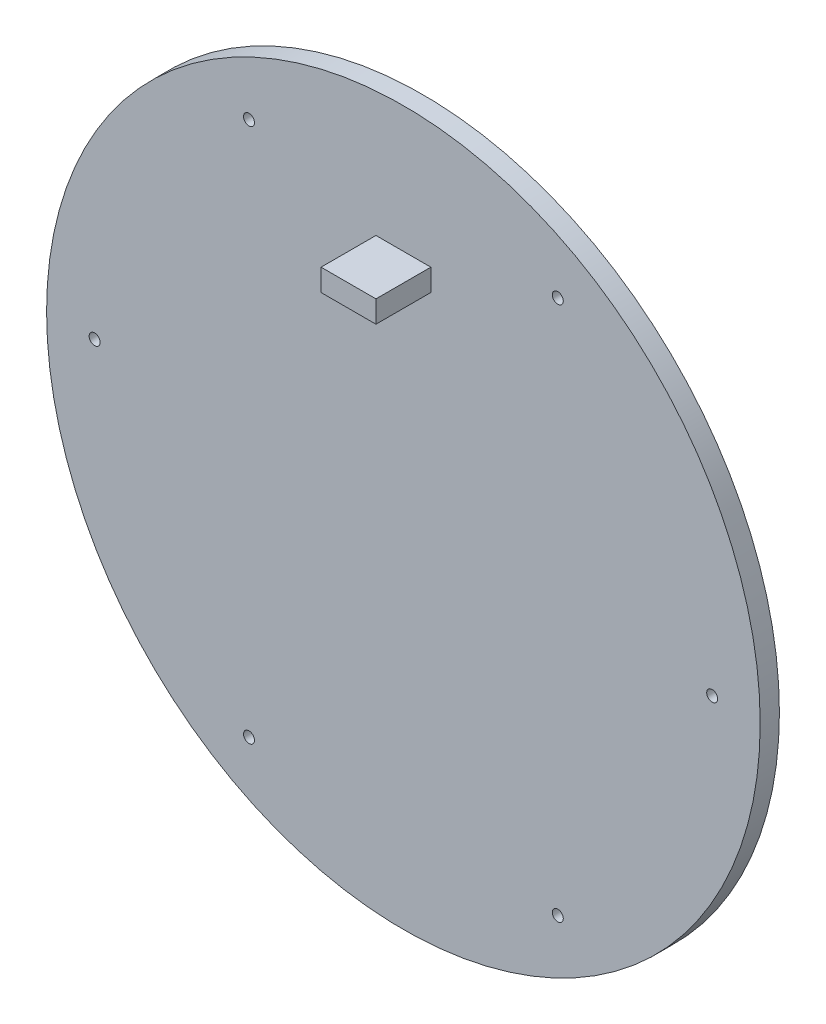
ISO-10303-21;
HEADER;
FILE_DESCRIPTION(('STEP AP214'),'2;1');
FILE_NAME('part.step','',(''),(''),'','','');
FILE_SCHEMA(('AUTOMOTIVE_DESIGN { 1 0 10303 214 1 1 1 1 }'));
ENDSEC;
DATA;
#1=APPLICATION_CONTEXT('core data for automotive mechanical design processes');
#2=APPLICATION_PROTOCOL_DEFINITION('international standard','automotive_design',2000,#1);
#3=PRODUCT_CONTEXT('',#1,'mechanical');
#4=PRODUCT('Part','Part','',(#3));
#5=PRODUCT_RELATED_PRODUCT_CATEGORY('part','',(#4));
#6=PRODUCT_DEFINITION_FORMATION('','',#4);
#7=PRODUCT_DEFINITION_CONTEXT('part definition',#1,'design');
#8=PRODUCT_DEFINITION('design','',#6,#7);
#9=PRODUCT_DEFINITION_SHAPE('','',#8);
#10=(LENGTH_UNIT() NAMED_UNIT(*) SI_UNIT(.MILLI.,.METRE.));
#11=(NAMED_UNIT(*) PLANE_ANGLE_UNIT() SI_UNIT($,.RADIAN.));
#12=(NAMED_UNIT(*) SI_UNIT($,.STERADIAN.) SOLID_ANGLE_UNIT());
#13=UNCERTAINTY_MEASURE_WITH_UNIT(LENGTH_MEASURE(1.E-05),#10,'distance_accuracy_value','');
#14=(GEOMETRIC_REPRESENTATION_CONTEXT(3) GLOBAL_UNCERTAINTY_ASSIGNED_CONTEXT((#13)) GLOBAL_UNIT_ASSIGNED_CONTEXT((#10,
#11,#12)) REPRESENTATION_CONTEXT('',''));
#15=CARTESIAN_POINT('',(0.,0.,0.));
#16=DIRECTION('',(0.,0.,1.));
#17=DIRECTION('',(1.,0.,0.));
#18=AXIS2_PLACEMENT_3D('',#15,#16,#17);
#19=CARTESIAN_POINT('',(0.,0.,3.5));
#20=DIRECTION('',(0.,0.,1.));
#21=DIRECTION('',(1.,0.,0.));
#22=AXIS2_PLACEMENT_3D('',#19,#20,#21);
#23=PLANE('',#22);
#24=CARTESIAN_POINT('',(-56.25,0.,3.5));
#25=DIRECTION('',(0.,0.,1.));
#26=DIRECTION('',(1.,0.,0.));
#27=AXIS2_PLACEMENT_3D('',#24,#25,#26);
#28=CIRCLE('',#27,0.999999999999998);
#29=CARTESIAN_POINT('',(-55.25,0.,3.5));
#30=VERTEX_POINT('',#29);
#31=EDGE_CURVE('E171',#30,#30,#28,.T.);
#32=ORIENTED_EDGE('',*,*,#31,.F.);
#33=EDGE_LOOP('',(#32));
#34=FACE_BOUND('',#33,.T.);
#35=CARTESIAN_POINT('',(-28.1250000000006,48.7139289628743,3.5));
#36=DIRECTION('',(0.,0.,1.));
#37=DIRECTION('',(1.,0.,0.));
#38=AXIS2_PLACEMENT_3D('',#35,#36,#37);
#39=CIRCLE('',#38,0.999999999999995);
#40=CARTESIAN_POINT('',(-27.1250000000006,48.7139289628743,3.5));
#41=VERTEX_POINT('',#40);
#42=EDGE_CURVE('E176',#41,#41,#39,.T.);
#43=ORIENTED_EDGE('',*,*,#42,.F.);
#44=EDGE_LOOP('',(#43));
#45=FACE_BOUND('',#44,.T.);
#46=CARTESIAN_POINT('',(28.1249999999995,48.7139289628749,3.5));
#47=DIRECTION('',(0.,0.,1.));
#48=DIRECTION('',(1.,0.,0.));
#49=AXIS2_PLACEMENT_3D('',#46,#47,#48);
#50=CIRCLE('',#49,0.999999999999996);
#51=CARTESIAN_POINT('',(29.1249999999995,48.7139289628749,3.5));
#52=VERTEX_POINT('',#51);
#53=EDGE_CURVE('E230',#52,#52,#50,.T.);
#54=ORIENTED_EDGE('',*,*,#53,.F.);
#55=EDGE_LOOP('',(#54));
#56=FACE_BOUND('',#55,.T.);
#57=CARTESIAN_POINT('',(56.25,3.92791650619852E-13,3.5));
#58=DIRECTION('',(0.,0.,1.));
#59=DIRECTION('',(1.,0.,0.));
#60=AXIS2_PLACEMENT_3D('',#57,#58,#59);
#61=CIRCLE('',#60,0.999999999999996);
#62=CARTESIAN_POINT('',(57.25,3.92791650619852E-13,3.5));
#63=VERTEX_POINT('',#62);
#64=EDGE_CURVE('E233',#63,#63,#61,.T.);
#65=ORIENTED_EDGE('',*,*,#64,.F.);
#66=EDGE_LOOP('',(#65));
#67=FACE_BOUND('',#66,.T.);
#68=CARTESIAN_POINT('',(28.1250000000002,-48.7139289628746,3.5));
#69=DIRECTION('',(0.,0.,1.));
#70=DIRECTION('',(1.,0.,0.));
#71=AXIS2_PLACEMENT_3D('',#68,#69,#70);
#72=CIRCLE('',#71,0.999999999999994);
#73=CARTESIAN_POINT('',(29.1250000000002,-48.7139289628746,3.5));
#74=VERTEX_POINT('',#73);
#75=EDGE_CURVE('E236',#74,#74,#72,.T.);
#76=ORIENTED_EDGE('',*,*,#75,.F.);
#77=EDGE_LOOP('',(#76));
#78=FACE_BOUND('',#77,.T.);
#79=CARTESIAN_POINT('',(-28.1249999999999,-48.7139289628747,3.5));
#80=DIRECTION('',(0.,0.,1.));
#81=DIRECTION('',(1.,0.,0.));
#82=AXIS2_PLACEMENT_3D('',#79,#80,#81);
#83=CIRCLE('',#82,0.999999999999996);
#84=CARTESIAN_POINT('',(-27.1249999999999,-48.7139289628747,3.5));
#85=VERTEX_POINT('',#84);
#86=EDGE_CURVE('E239',#85,#85,#83,.T.);
#87=ORIENTED_EDGE('',*,*,#86,.F.);
#88=EDGE_LOOP('',(#87));
#89=FACE_BOUND('',#88,.T.);
#90=CARTESIAN_POINT('',(0.,0.,3.5));
#91=DIRECTION('',(0.,0.,1.));
#92=DIRECTION('',(1.,0.,0.));
#93=AXIS2_PLACEMENT_3D('',#90,#91,#92);
#94=CIRCLE('',#93,65.);
#95=CARTESIAN_POINT('',(65.,0.,3.5));
#96=VERTEX_POINT('',#95);
#97=EDGE_CURVE('E143',#96,#96,#94,.T.);
#98=ORIENTED_EDGE('',*,*,#97,.T.);
#99=EDGE_LOOP('',(#98));
#100=FACE_BOUND('',#99,.T.);
#101=DIRECTION('',(1.,0.,0.));
#102=VECTOR('',#101,1.);
#103=CARTESIAN_POINT('',(0.,42.,3.5));
#104=LINE('',#103,#102);
#105=CARTESIAN_POINT('',(-5.,42.,3.5));
#106=VERTEX_POINT('',#105);
#107=CARTESIAN_POINT('',(5.,42.,3.5));
#108=VERTEX_POINT('',#107);
#109=EDGE_CURVE('E139',#106,#108,#104,.T.);
#110=ORIENTED_EDGE('',*,*,#109,.T.);
#111=DIRECTION('',(0.,-1.,0.));
#112=VECTOR('',#111,1.);
#113=CARTESIAN_POINT('',(5.,0.,3.5));
#114=LINE('',#113,#112);
#115=CARTESIAN_POINT('',(5.,38.,3.5));
#116=VERTEX_POINT('',#115);
#117=EDGE_CURVE('E127',#108,#116,#114,.T.);
#118=ORIENTED_EDGE('',*,*,#117,.T.);
#119=DIRECTION('',(-1.,0.,0.));
#120=VECTOR('',#119,1.);
#121=CARTESIAN_POINT('',(0.,38.,3.5));
#122=LINE('',#121,#120);
#123=CARTESIAN_POINT('',(-5.,38.,3.5));
#124=VERTEX_POINT('',#123);
#125=EDGE_CURVE('E128',#116,#124,#122,.T.);
#126=ORIENTED_EDGE('',*,*,#125,.T.);
#127=DIRECTION('',(0.,1.,0.));
#128=VECTOR('',#127,1.);
#129=CARTESIAN_POINT('',(-5.,0.,3.5));
#130=LINE('',#129,#128);
#131=EDGE_CURVE('E132',#124,#106,#130,.T.);
#132=ORIENTED_EDGE('',*,*,#131,.T.);
#133=EDGE_LOOP('',(#110,#118,#126,#132));
#134=FACE_BOUND('',#133,.T.);
#135=ADVANCED_FACE('F40',(#34,#45,#56,#67,#78,#89,#100,#134),#23,.T.);
#136=CARTESIAN_POINT('',(0.,0.,0.));
#137=DIRECTION('',(0.,0.,1.));
#138=DIRECTION('',(1.,0.,0.));
#139=AXIS2_PLACEMENT_3D('',#136,#137,#138);
#140=PLANE('',#139);
#141=CARTESIAN_POINT('',(-56.25,0.,0.));
#142=DIRECTION('',(0.,0.,-1.));
#143=DIRECTION('',(-1.,0.,0.));
#144=AXIS2_PLACEMENT_3D('',#141,#142,#143);
#145=CIRCLE('',#144,0.999999999999998);
#146=CARTESIAN_POINT('',(-57.25,0.,0.));
#147=VERTEX_POINT('',#146);
#148=EDGE_CURVE('E242',#147,#147,#145,.T.);
#149=ORIENTED_EDGE('',*,*,#148,.F.);
#150=EDGE_LOOP('',(#149));
#151=FACE_BOUND('',#150,.T.);
#152=CARTESIAN_POINT('',(-28.1250000000006,48.7139289628743,0.));
#153=DIRECTION('',(0.,0.,-1.));
#154=DIRECTION('',(-1.,0.,0.));
#155=AXIS2_PLACEMENT_3D('',#152,#153,#154);
#156=CIRCLE('',#155,0.999999999999995);
#157=CARTESIAN_POINT('',(-29.1250000000006,48.7139289628743,0.));
#158=VERTEX_POINT('',#157);
#159=EDGE_CURVE('E247',#158,#158,#156,.T.);
#160=ORIENTED_EDGE('',*,*,#159,.F.);
#161=EDGE_LOOP('',(#160));
#162=FACE_BOUND('',#161,.T.);
#163=CARTESIAN_POINT('',(28.1249999999995,48.7139289628749,0.));
#164=DIRECTION('',(0.,0.,-1.));
#165=DIRECTION('',(-1.,0.,0.));
#166=AXIS2_PLACEMENT_3D('',#163,#164,#165);
#167=CIRCLE('',#166,0.999999999999996);
#168=CARTESIAN_POINT('',(27.1249999999996,48.7139289628749,0.));
#169=VERTEX_POINT('',#168);
#170=EDGE_CURVE('E243',#169,#169,#167,.T.);
#171=ORIENTED_EDGE('',*,*,#170,.F.);
#172=EDGE_LOOP('',(#171));
#173=FACE_BOUND('',#172,.T.);
#174=CARTESIAN_POINT('',(56.25,3.92791650619852E-13,0.));
#175=DIRECTION('',(0.,0.,-1.));
#176=DIRECTION('',(-1.,0.,0.));
#177=AXIS2_PLACEMENT_3D('',#174,#175,#176);
#178=CIRCLE('',#177,0.999999999999996);
#179=CARTESIAN_POINT('',(55.25,3.92791650619852E-13,0.));
#180=VERTEX_POINT('',#179);
#181=EDGE_CURVE('E246',#180,#180,#178,.T.);
#182=ORIENTED_EDGE('',*,*,#181,.F.);
#183=EDGE_LOOP('',(#182));
#184=FACE_BOUND('',#183,.T.);
#185=CARTESIAN_POINT('',(28.1250000000002,-48.7139289628746,0.));
#186=DIRECTION('',(0.,0.,-1.));
#187=DIRECTION('',(-1.,0.,0.));
#188=AXIS2_PLACEMENT_3D('',#185,#186,#187);
#189=CIRCLE('',#188,0.999999999999994);
#190=CARTESIAN_POINT('',(27.1250000000002,-48.7139289628746,0.));
#191=VERTEX_POINT('',#190);
#192=EDGE_CURVE('E250',#191,#191,#189,.T.);
#193=ORIENTED_EDGE('',*,*,#192,.F.);
#194=EDGE_LOOP('',(#193));
#195=FACE_BOUND('',#194,.T.);
#196=CARTESIAN_POINT('',(-28.1249999999999,-48.7139289628747,0.));
#197=DIRECTION('',(0.,0.,-1.));
#198=DIRECTION('',(-1.,0.,0.));
#199=AXIS2_PLACEMENT_3D('',#196,#197,#198);
#200=CIRCLE('',#199,0.999999999999996);
#201=CARTESIAN_POINT('',(-29.1249999999999,-48.7139289628747,0.));
#202=VERTEX_POINT('',#201);
#203=EDGE_CURVE('E253',#202,#202,#200,.T.);
#204=ORIENTED_EDGE('',*,*,#203,.F.);
#205=EDGE_LOOP('',(#204));
#206=FACE_BOUND('',#205,.T.);
#207=CARTESIAN_POINT('',(0.,0.,0.));
#208=DIRECTION('',(0.,0.,1.));
#209=DIRECTION('',(1.,0.,0.));
#210=AXIS2_PLACEMENT_3D('',#207,#208,#209);
#211=CIRCLE('',#210,65.);
#212=CARTESIAN_POINT('',(65.,0.,0.));
#213=VERTEX_POINT('',#212);
#214=EDGE_CURVE('E142',#213,#213,#211,.T.);
#215=ORIENTED_EDGE('',*,*,#214,.F.);
#216=EDGE_LOOP('',(#215));
#217=FACE_BOUND('',#216,.T.);
#218=DIRECTION('',(0.,-1.,0.));
#219=VECTOR('',#218,1.);
#220=CARTESIAN_POINT('',(5.,0.,0.));
#221=LINE('',#220,#219);
#222=CARTESIAN_POINT('',(5.,42.,0.));
#223=VERTEX_POINT('',#222);
#224=CARTESIAN_POINT('',(5.,38.,0.));
#225=VERTEX_POINT('',#224);
#226=EDGE_CURVE('E11',#223,#225,#221,.T.);
#227=ORIENTED_EDGE('',*,*,#226,.F.);
#228=DIRECTION('',(1.,0.,0.));
#229=VECTOR('',#228,1.);
#230=CARTESIAN_POINT('',(0.,42.,0.));
#231=LINE('',#230,#229);
#232=CARTESIAN_POINT('',(-5.,42.,0.));
#233=VERTEX_POINT('',#232);
#234=EDGE_CURVE('E48',#233,#223,#231,.T.);
#235=ORIENTED_EDGE('',*,*,#234,.F.);
#236=DIRECTION('',(0.,1.,0.));
#237=VECTOR('',#236,1.);
#238=CARTESIAN_POINT('',(-5.,0.,0.));
#239=LINE('',#238,#237);
#240=CARTESIAN_POINT('',(-5.,38.,0.));
#241=VERTEX_POINT('',#240);
#242=EDGE_CURVE('E151',#241,#233,#239,.T.);
#243=ORIENTED_EDGE('',*,*,#242,.F.);
#244=DIRECTION('',(-1.,0.,0.));
#245=VECTOR('',#244,1.);
#246=CARTESIAN_POINT('',(0.,38.,0.));
#247=LINE('',#246,#245);
#248=EDGE_CURVE('E146',#225,#241,#247,.T.);
#249=ORIENTED_EDGE('',*,*,#248,.F.);
#250=EDGE_LOOP('',(#227,#235,#243,#249));
#251=FACE_BOUND('',#250,.T.);
#252=ADVANCED_FACE('F201',(#151,#162,#173,#184,#195,#206,#217,#251),#140,.F.);
#253=CARTESIAN_POINT('',(0.,0.,3.5));
#254=DIRECTION('',(0.,0.,-1.));
#255=DIRECTION('',(-1.,0.,0.));
#256=AXIS2_PLACEMENT_3D('',#253,#254,#255);
#257=CYLINDRICAL_SURFACE('',#256,65.);
#258=ORIENTED_EDGE('',*,*,#97,.F.);
#259=EDGE_LOOP('',(#258));
#260=FACE_BOUND('',#259,.T.);
#261=ORIENTED_EDGE('',*,*,#214,.T.);
#262=EDGE_LOOP('',(#261));
#263=FACE_BOUND('',#262,.T.);
#264=ADVANCED_FACE('F42',(#260,#263),#257,.T.);
#265=CARTESIAN_POINT('',(0.,0.,-6.5));
#266=DIRECTION('',(0.,0.,-1.));
#267=DIRECTION('',(-1.,0.,0.));
#268=AXIS2_PLACEMENT_3D('',#265,#266,#267);
#269=PLANE('',#268);
#270=DIRECTION('',(0.,1.,0.));
#271=VECTOR('',#270,1.);
#272=CARTESIAN_POINT('',(5.,38.,-6.5));
#273=LINE('',#272,#271);
#274=CARTESIAN_POINT('',(5.,38.,-6.5));
#275=VERTEX_POINT('',#274);
#276=CARTESIAN_POINT('',(5.,42.,-6.5));
#277=VERTEX_POINT('',#276);
#278=EDGE_CURVE('E165',#275,#277,#273,.T.);
#279=ORIENTED_EDGE('',*,*,#278,.F.);
#280=DIRECTION('',(1.,0.,0.));
#281=VECTOR('',#280,1.);
#282=CARTESIAN_POINT('',(-5.,38.,-6.5));
#283=LINE('',#282,#281);
#284=CARTESIAN_POINT('',(-5.,38.,-6.5));
#285=VERTEX_POINT('',#284);
#286=EDGE_CURVE('E123',#285,#275,#283,.T.);
#287=ORIENTED_EDGE('',*,*,#286,.F.);
#288=DIRECTION('',(0.,-1.,0.));
#289=VECTOR('',#288,1.);
#290=CARTESIAN_POINT('',(-5.,38.,-6.5));
#291=LINE('',#290,#289);
#292=CARTESIAN_POINT('',(-5.,42.,-6.5));
#293=VERTEX_POINT('',#292);
#294=EDGE_CURVE('E173',#293,#285,#291,.T.);
#295=ORIENTED_EDGE('',*,*,#294,.F.);
#296=DIRECTION('',(-1.,0.,0.));
#297=VECTOR('',#296,1.);
#298=CARTESIAN_POINT('',(-5.,42.,-6.5));
#299=LINE('',#298,#297);
#300=EDGE_CURVE('E170',#277,#293,#299,.T.);
#301=ORIENTED_EDGE('',*,*,#300,.F.);
#302=EDGE_LOOP('',(#279,#287,#295,#301));
#303=FACE_BOUND('',#302,.T.);
#304=ADVANCED_FACE('F192',(#303),#269,.T.);
#305=CARTESIAN_POINT('',(-5.,38.,13.5));
#306=DIRECTION('',(0.,1.,0.));
#307=DIRECTION('',(0.,0.,1.));
#308=AXIS2_PLACEMENT_3D('',#305,#306,#307);
#309=PLANE('',#308);
#310=DIRECTION('',(0.,0.,-1.));
#311=VECTOR('',#310,1.);
#312=CARTESIAN_POINT('',(5.,38.,13.5));
#313=LINE('',#312,#311);
#314=EDGE_CURVE('E166',#225,#275,#313,.T.);
#315=ORIENTED_EDGE('',*,*,#314,.F.);
#316=ORIENTED_EDGE('',*,*,#248,.T.);
#317=DIRECTION('',(0.,0.,-1.));
#318=VECTOR('',#317,1.);
#319=CARTESIAN_POINT('',(-5.,38.,13.5));
#320=LINE('',#319,#318);
#321=EDGE_CURVE('E185',#241,#285,#320,.T.);
#322=ORIENTED_EDGE('',*,*,#321,.T.);
#323=ORIENTED_EDGE('',*,*,#286,.T.);
#324=EDGE_LOOP('',(#315,#316,#322,#323));
#325=FACE_BOUND('',#324,.T.);
#326=ADVANCED_FACE('F188',(#325),#309,.F.);
#327=CARTESIAN_POINT('',(-5.,38.,13.5));
#328=DIRECTION('',(1.,0.,0.));
#329=DIRECTION('',(0.,0.,-1.));
#330=AXIS2_PLACEMENT_3D('',#327,#328,#329);
#331=PLANE('',#330);
#332=ORIENTED_EDGE('',*,*,#321,.F.);
#333=ORIENTED_EDGE('',*,*,#242,.T.);
#334=DIRECTION('',(0.,0.,-1.));
#335=VECTOR('',#334,1.);
#336=CARTESIAN_POINT('',(-5.,42.,13.5));
#337=LINE('',#336,#335);
#338=EDGE_CURVE('E159',#233,#293,#337,.T.);
#339=ORIENTED_EDGE('',*,*,#338,.T.);
#340=ORIENTED_EDGE('',*,*,#294,.T.);
#341=EDGE_LOOP('',(#332,#333,#339,#340));
#342=FACE_BOUND('',#341,.T.);
#343=ADVANCED_FACE('F191',(#342),#331,.F.);
#344=CARTESIAN_POINT('',(-5.,42.,13.5));
#345=DIRECTION('',(0.,-1.,0.));
#346=DIRECTION('',(0.,0.,-1.));
#347=AXIS2_PLACEMENT_3D('',#344,#345,#346);
#348=PLANE('',#347);
#349=ORIENTED_EDGE('',*,*,#338,.F.);
#350=ORIENTED_EDGE('',*,*,#234,.T.);
#351=DIRECTION('',(0.,0.,-1.));
#352=VECTOR('',#351,1.);
#353=CARTESIAN_POINT('',(5.,42.,13.5));
#354=LINE('',#353,#352);
#355=EDGE_CURVE('E129',#223,#277,#354,.T.);
#356=ORIENTED_EDGE('',*,*,#355,.T.);
#357=ORIENTED_EDGE('',*,*,#300,.T.);
#358=EDGE_LOOP('',(#349,#350,#356,#357));
#359=FACE_BOUND('',#358,.T.);
#360=ADVANCED_FACE('F156',(#359),#348,.F.);
#361=CARTESIAN_POINT('',(5.,38.,13.5));
#362=DIRECTION('',(-1.,0.,0.));
#363=DIRECTION('',(0.,0.,1.));
#364=AXIS2_PLACEMENT_3D('',#361,#362,#363);
#365=PLANE('',#364);
#366=ORIENTED_EDGE('',*,*,#355,.F.);
#367=ORIENTED_EDGE('',*,*,#226,.T.);
#368=ORIENTED_EDGE('',*,*,#314,.T.);
#369=ORIENTED_EDGE('',*,*,#278,.T.);
#370=EDGE_LOOP('',(#366,#367,#368,#369));
#371=FACE_BOUND('',#370,.T.);
#372=ADVANCED_FACE('F162',(#371),#365,.F.);
#373=ORIENTED_EDGE('',*,*,#117,.F.);
#374=CARTESIAN_POINT('',(5.,42.,13.5));
#375=VERTEX_POINT('',#374);
#376=EDGE_CURVE('E108',#375,#108,#354,.T.);
#377=ORIENTED_EDGE('',*,*,#376,.F.);
#378=DIRECTION('',(0.,1.,0.));
#379=VECTOR('',#378,1.);
#380=CARTESIAN_POINT('',(5.,38.,13.5));
#381=LINE('',#380,#379);
#382=CARTESIAN_POINT('',(5.,38.,13.5));
#383=VERTEX_POINT('',#382);
#384=EDGE_CURVE('E115',#383,#375,#381,.T.);
#385=ORIENTED_EDGE('',*,*,#384,.F.);
#386=EDGE_CURVE('E184',#383,#116,#313,.T.);
#387=ORIENTED_EDGE('',*,*,#386,.T.);
#388=EDGE_LOOP('',(#373,#377,#385,#387));
#389=FACE_BOUND('',#388,.T.);
#390=ADVANCED_FACE('F125',(#389),#365,.F.);
#391=ORIENTED_EDGE('',*,*,#109,.F.);
#392=CARTESIAN_POINT('',(-5.,42.,13.5));
#393=VERTEX_POINT('',#392);
#394=EDGE_CURVE('E111',#393,#106,#337,.T.);
#395=ORIENTED_EDGE('',*,*,#394,.F.);
#396=DIRECTION('',(-1.,0.,0.));
#397=VECTOR('',#396,1.);
#398=CARTESIAN_POINT('',(-5.,42.,13.5));
#399=LINE('',#398,#397);
#400=EDGE_CURVE('E104',#375,#393,#399,.T.);
#401=ORIENTED_EDGE('',*,*,#400,.F.);
#402=ORIENTED_EDGE('',*,*,#376,.T.);
#403=EDGE_LOOP('',(#391,#395,#401,#402));
#404=FACE_BOUND('',#403,.T.);
#405=ADVANCED_FACE('F106',(#404),#348,.F.);
#406=ORIENTED_EDGE('',*,*,#131,.F.);
#407=CARTESIAN_POINT('',(-5.,38.,13.5));
#408=VERTEX_POINT('',#407);
#409=EDGE_CURVE('E55',#408,#124,#320,.T.);
#410=ORIENTED_EDGE('',*,*,#409,.F.);
#411=DIRECTION('',(0.,-1.,0.));
#412=VECTOR('',#411,1.);
#413=CARTESIAN_POINT('',(-5.,38.,13.5));
#414=LINE('',#413,#412);
#415=EDGE_CURVE('E114',#393,#408,#414,.T.);
#416=ORIENTED_EDGE('',*,*,#415,.F.);
#417=ORIENTED_EDGE('',*,*,#394,.T.);
#418=EDGE_LOOP('',(#406,#410,#416,#417));
#419=FACE_BOUND('',#418,.T.);
#420=ADVANCED_FACE('F218',(#419),#331,.F.);
#421=ORIENTED_EDGE('',*,*,#125,.F.);
#422=ORIENTED_EDGE('',*,*,#386,.F.);
#423=DIRECTION('',(1.,0.,0.));
#424=VECTOR('',#423,1.);
#425=CARTESIAN_POINT('',(-5.,38.,13.5));
#426=LINE('',#425,#424);
#427=EDGE_CURVE('E119',#408,#383,#426,.T.);
#428=ORIENTED_EDGE('',*,*,#427,.F.);
#429=ORIENTED_EDGE('',*,*,#409,.T.);
#430=EDGE_LOOP('',(#421,#422,#428,#429));
#431=FACE_BOUND('',#430,.T.);
#432=ADVANCED_FACE('F200',(#431),#309,.F.);
#433=CARTESIAN_POINT('',(0.,0.,13.5));
#434=DIRECTION('',(0.,0.,-1.));
#435=DIRECTION('',(-1.,0.,0.));
#436=AXIS2_PLACEMENT_3D('',#433,#434,#435);
#437=PLANE('',#436);
#438=ORIENTED_EDGE('',*,*,#384,.T.);
#439=ORIENTED_EDGE('',*,*,#400,.T.);
#440=ORIENTED_EDGE('',*,*,#415,.T.);
#441=ORIENTED_EDGE('',*,*,#427,.T.);
#442=EDGE_LOOP('',(#438,#439,#440,#441));
#443=FACE_BOUND('',#442,.T.);
#444=ADVANCED_FACE('F118',(#443),#437,.F.);
#445=CARTESIAN_POINT('',(-28.1249999999999,-48.7139289628747,10.));
#446=DIRECTION('',(0.,0.,-1.));
#447=DIRECTION('',(-1.,0.,0.));
#448=AXIS2_PLACEMENT_3D('',#445,#446,#447);
#449=CYLINDRICAL_SURFACE('',#448,0.999999999999996);
#450=ORIENTED_EDGE('',*,*,#86,.T.);
#451=EDGE_LOOP('',(#450));
#452=FACE_BOUND('',#451,.T.);
#453=ORIENTED_EDGE('',*,*,#203,.T.);
#454=EDGE_LOOP('',(#453));
#455=FACE_BOUND('',#454,.T.);
#456=ADVANCED_FACE('F225',(#452,#455),#449,.F.);
#457=CARTESIAN_POINT('',(28.1250000000002,-48.7139289628746,10.));
#458=DIRECTION('',(0.,0.,-1.));
#459=DIRECTION('',(-1.,0.,0.));
#460=AXIS2_PLACEMENT_3D('',#457,#458,#459);
#461=CYLINDRICAL_SURFACE('',#460,0.999999999999994);
#462=ORIENTED_EDGE('',*,*,#75,.T.);
#463=EDGE_LOOP('',(#462));
#464=FACE_BOUND('',#463,.T.);
#465=ORIENTED_EDGE('',*,*,#192,.T.);
#466=EDGE_LOOP('',(#465));
#467=FACE_BOUND('',#466,.T.);
#468=ADVANCED_FACE('F277',(#464,#467),#461,.F.);
#469=CARTESIAN_POINT('',(56.25,3.92791650619852E-13,10.));
#470=DIRECTION('',(0.,0.,-1.));
#471=DIRECTION('',(-1.,0.,0.));
#472=AXIS2_PLACEMENT_3D('',#469,#470,#471);
#473=CYLINDRICAL_SURFACE('',#472,0.999999999999996);
#474=ORIENTED_EDGE('',*,*,#64,.T.);
#475=EDGE_LOOP('',(#474));
#476=FACE_BOUND('',#475,.T.);
#477=ORIENTED_EDGE('',*,*,#181,.T.);
#478=EDGE_LOOP('',(#477));
#479=FACE_BOUND('',#478,.T.);
#480=ADVANCED_FACE('F283',(#476,#479),#473,.F.);
#481=CARTESIAN_POINT('',(28.1249999999995,48.7139289628749,10.));
#482=DIRECTION('',(0.,0.,-1.));
#483=DIRECTION('',(-1.,0.,0.));
#484=AXIS2_PLACEMENT_3D('',#481,#482,#483);
#485=CYLINDRICAL_SURFACE('',#484,0.999999999999996);
#486=ORIENTED_EDGE('',*,*,#53,.T.);
#487=EDGE_LOOP('',(#486));
#488=FACE_BOUND('',#487,.T.);
#489=ORIENTED_EDGE('',*,*,#170,.T.);
#490=EDGE_LOOP('',(#489));
#491=FACE_BOUND('',#490,.T.);
#492=ADVANCED_FACE('F292',(#488,#491),#485,.F.);
#493=CARTESIAN_POINT('',(-28.1250000000006,48.7139289628743,10.));
#494=DIRECTION('',(0.,0.,-1.));
#495=DIRECTION('',(-1.,0.,0.));
#496=AXIS2_PLACEMENT_3D('',#493,#494,#495);
#497=CYLINDRICAL_SURFACE('',#496,0.999999999999995);
#498=ORIENTED_EDGE('',*,*,#42,.T.);
#499=EDGE_LOOP('',(#498));
#500=FACE_BOUND('',#499,.T.);
#501=ORIENTED_EDGE('',*,*,#159,.T.);
#502=EDGE_LOOP('',(#501));
#503=FACE_BOUND('',#502,.T.);
#504=ADVANCED_FACE('F287',(#500,#503),#497,.F.);
#505=CARTESIAN_POINT('',(-56.25,0.,10.));
#506=DIRECTION('',(0.,0.,-1.));
#507=DIRECTION('',(-1.,0.,0.));
#508=AXIS2_PLACEMENT_3D('',#505,#506,#507);
#509=CYLINDRICAL_SURFACE('',#508,0.999999999999998);
#510=ORIENTED_EDGE('',*,*,#31,.T.);
#511=EDGE_LOOP('',(#510));
#512=FACE_BOUND('',#511,.T.);
#513=ORIENTED_EDGE('',*,*,#148,.T.);
#514=EDGE_LOOP('',(#513));
#515=FACE_BOUND('',#514,.T.);
#516=ADVANCED_FACE('F261',(#512,#515),#509,.F.);
#517=CLOSED_SHELL('',(#135,#252,#264,#304,#326,#343,#360,#372,#390,#405,#420,#432,#444,#456,
#468,#480,#492,#504,#516));
#518=MANIFOLD_SOLID_BREP('B2',#517);
#519=ADVANCED_BREP_SHAPE_REPRESENTATION('',(#18,#518),#14);
#520=SHAPE_DEFINITION_REPRESENTATION(#9,#519);
ENDSEC;
END-ISO-10303-21;
